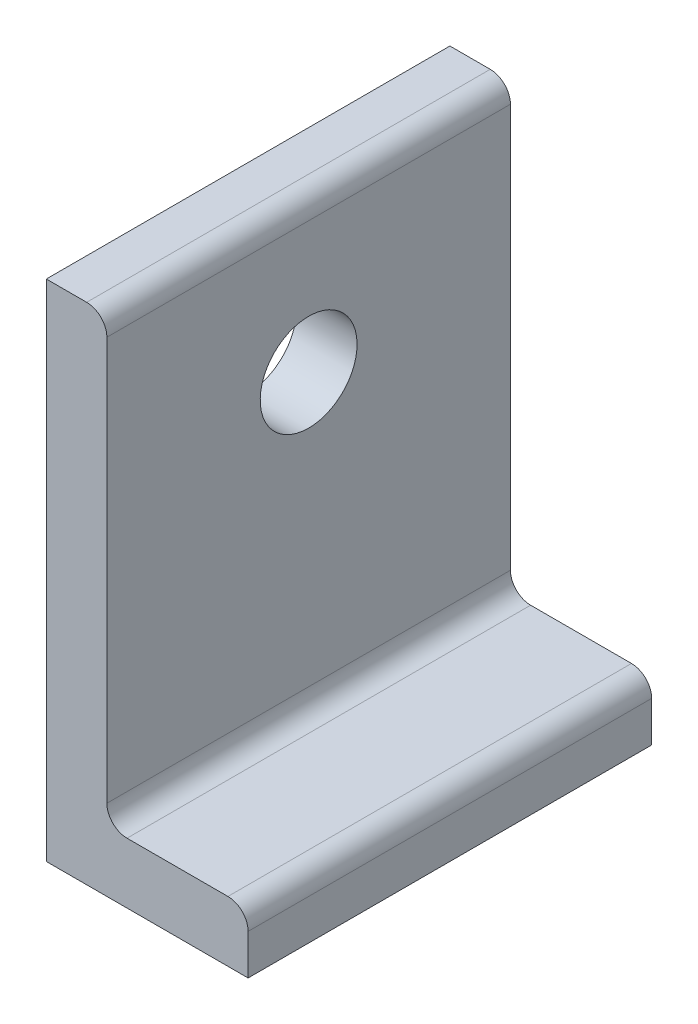
ISO-10303-21;
HEADER;
FILE_DESCRIPTION(('STEP AP214'),'2;1');
FILE_NAME('part.step','',(''),(''),'','','');
FILE_SCHEMA(('AUTOMOTIVE_DESIGN { 1 0 10303 214 1 1 1 1 }'));
ENDSEC;
DATA;
#1=APPLICATION_CONTEXT('core data for automotive mechanical design processes');
#2=APPLICATION_PROTOCOL_DEFINITION('international standard','automotive_design',2000,#1);
#3=PRODUCT_CONTEXT('',#1,'mechanical');
#4=PRODUCT('Part','Part','',(#3));
#5=PRODUCT_RELATED_PRODUCT_CATEGORY('part','',(#4));
#6=PRODUCT_DEFINITION_FORMATION('','',#4);
#7=PRODUCT_DEFINITION_CONTEXT('part definition',#1,'design');
#8=PRODUCT_DEFINITION('design','',#6,#7);
#9=PRODUCT_DEFINITION_SHAPE('','',#8);
#10=(LENGTH_UNIT() NAMED_UNIT(*) SI_UNIT(.MILLI.,.METRE.));
#11=(NAMED_UNIT(*) PLANE_ANGLE_UNIT() SI_UNIT($,.RADIAN.));
#12=(NAMED_UNIT(*) SI_UNIT($,.STERADIAN.) SOLID_ANGLE_UNIT());
#13=UNCERTAINTY_MEASURE_WITH_UNIT(LENGTH_MEASURE(1.E-05),#10,'distance_accuracy_value','');
#14=(GEOMETRIC_REPRESENTATION_CONTEXT(3) GLOBAL_UNCERTAINTY_ASSIGNED_CONTEXT((#13)) GLOBAL_UNIT_ASSIGNED_CONTEXT((#10,
#11,#12)) REPRESENTATION_CONTEXT('',''));
#15=CARTESIAN_POINT('',(0.,0.,0.));
#16=DIRECTION('',(0.,0.,1.));
#17=DIRECTION('',(1.,0.,0.));
#18=AXIS2_PLACEMENT_3D('',#15,#16,#17);
#19=CARTESIAN_POINT('',(3.,25.,20.));
#20=DIRECTION('',(0.,-1.,0.));
#21=DIRECTION('',(0.,0.,-1.));
#22=AXIS2_PLACEMENT_3D('',#19,#20,#21);
#23=PLANE('',#22);
#24=DIRECTION('',(-1.,0.,0.));
#25=VECTOR('',#24,1.);
#26=CARTESIAN_POINT('',(3.,25.,20.));
#27=LINE('',#26,#25);
#28=CARTESIAN_POINT('',(2.,25.,20.));
#29=VERTEX_POINT('',#28);
#30=CARTESIAN_POINT('',(0.,25.,20.));
#31=VERTEX_POINT('',#30);
#32=EDGE_CURVE('E104',#29,#31,#27,.T.);
#33=ORIENTED_EDGE('',*,*,#32,.F.);
#34=DIRECTION('',(0.,0.,-1.));
#35=VECTOR('',#34,1.);
#36=CARTESIAN_POINT('',(2.,25.,20.));
#37=LINE('',#36,#35);
#38=CARTESIAN_POINT('',(2.,25.,0.));
#39=VERTEX_POINT('',#38);
#40=EDGE_CURVE('E153',#29,#39,#37,.T.);
#41=ORIENTED_EDGE('',*,*,#40,.T.);
#42=DIRECTION('',(-1.,0.,0.));
#43=VECTOR('',#42,1.);
#44=CARTESIAN_POINT('',(3.,25.,0.));
#45=LINE('',#44,#43);
#46=CARTESIAN_POINT('',(0.,25.,0.));
#47=VERTEX_POINT('',#46);
#48=EDGE_CURVE('E128',#39,#47,#45,.T.);
#49=ORIENTED_EDGE('',*,*,#48,.T.);
#50=DIRECTION('',(0.,0.,-1.));
#51=VECTOR('',#50,1.);
#52=CARTESIAN_POINT('',(0.,25.,20.));
#53=LINE('',#52,#51);
#54=EDGE_CURVE('E121',#31,#47,#53,.T.);
#55=ORIENTED_EDGE('',*,*,#54,.F.);
#56=EDGE_LOOP('',(#33,#41,#49,#55));
#57=FACE_BOUND('',#56,.T.);
#58=ADVANCED_FACE('F35',(#57),#23,.F.);
#59=CARTESIAN_POINT('',(0.,25.,20.));
#60=DIRECTION('',(1.,0.,0.));
#61=DIRECTION('',(0.,1.,0.));
#62=AXIS2_PLACEMENT_3D('',#59,#60,#61);
#63=PLANE('',#62);
#64=CARTESIAN_POINT('',(0.,17.5,10.));
#65=DIRECTION('',(-1.,0.,0.));
#66=DIRECTION('',(0.,-1.,0.));
#67=AXIS2_PLACEMENT_3D('',#64,#65,#66);
#68=CIRCLE('',#67,2.4);
#69=CARTESIAN_POINT('',(0.,15.1,10.));
#70=VERTEX_POINT('',#69);
#71=EDGE_CURVE('E140',#70,#70,#68,.T.);
#72=ORIENTED_EDGE('',*,*,#71,.F.);
#73=EDGE_LOOP('',(#72));
#74=FACE_BOUND('',#73,.T.);
#75=DIRECTION('',(0.,-1.,0.));
#76=VECTOR('',#75,1.);
#77=CARTESIAN_POINT('',(0.,25.,0.));
#78=LINE('',#77,#76);
#79=CARTESIAN_POINT('',(0.,0.,0.));
#80=VERTEX_POINT('',#79);
#81=EDGE_CURVE('E183',#47,#80,#78,.T.);
#82=ORIENTED_EDGE('',*,*,#81,.T.);
#83=DIRECTION('',(0.,0.,-1.));
#84=VECTOR('',#83,1.);
#85=CARTESIAN_POINT('',(0.,0.,20.));
#86=LINE('',#85,#84);
#87=CARTESIAN_POINT('',(0.,0.,20.));
#88=VERTEX_POINT('',#87);
#89=EDGE_CURVE('E123',#88,#80,#86,.T.);
#90=ORIENTED_EDGE('',*,*,#89,.F.);
#91=DIRECTION('',(0.,-1.,0.));
#92=VECTOR('',#91,1.);
#93=CARTESIAN_POINT('',(0.,25.,20.));
#94=LINE('',#93,#92);
#95=EDGE_CURVE('E108',#31,#88,#94,.T.);
#96=ORIENTED_EDGE('',*,*,#95,.F.);
#97=ORIENTED_EDGE('',*,*,#54,.T.);
#98=EDGE_LOOP('',(#82,#90,#96,#97));
#99=FACE_BOUND('',#98,.T.);
#100=ADVANCED_FACE('F120',(#74,#99),#63,.F.);
#101=CARTESIAN_POINT('',(0.,0.,20.));
#102=DIRECTION('',(0.,1.,0.));
#103=DIRECTION('',(0.,0.,1.));
#104=AXIS2_PLACEMENT_3D('',#101,#102,#103);
#105=PLANE('',#104);
#106=DIRECTION('',(1.,0.,0.));
#107=VECTOR('',#106,1.);
#108=CARTESIAN_POINT('',(0.,0.,0.));
#109=LINE('',#108,#107);
#110=CARTESIAN_POINT('',(10.,0.,0.));
#111=VERTEX_POINT('',#110);
#112=EDGE_CURVE('E185',#80,#111,#109,.T.);
#113=ORIENTED_EDGE('',*,*,#112,.T.);
#114=DIRECTION('',(0.,0.,-1.));
#115=VECTOR('',#114,1.);
#116=CARTESIAN_POINT('',(10.,0.,20.));
#117=LINE('',#116,#115);
#118=CARTESIAN_POINT('',(10.,0.,20.));
#119=VERTEX_POINT('',#118);
#120=EDGE_CURVE('E134',#119,#111,#117,.T.);
#121=ORIENTED_EDGE('',*,*,#120,.F.);
#122=DIRECTION('',(1.,0.,0.));
#123=VECTOR('',#122,1.);
#124=CARTESIAN_POINT('',(0.,0.,20.));
#125=LINE('',#124,#123);
#126=EDGE_CURVE('E125',#88,#119,#125,.T.);
#127=ORIENTED_EDGE('',*,*,#126,.F.);
#128=ORIENTED_EDGE('',*,*,#89,.T.);
#129=EDGE_LOOP('',(#113,#121,#127,#128));
#130=FACE_BOUND('',#129,.T.);
#131=ADVANCED_FACE('F208',(#130),#105,.F.);
#132=CARTESIAN_POINT('',(10.,0.,20.));
#133=DIRECTION('',(-1.,0.,0.));
#134=DIRECTION('',(0.,0.,1.));
#135=AXIS2_PLACEMENT_3D('',#132,#133,#134);
#136=PLANE('',#135);
#137=DIRECTION('',(0.,1.,0.));
#138=VECTOR('',#137,1.);
#139=CARTESIAN_POINT('',(10.,0.,0.));
#140=LINE('',#139,#138);
#141=CARTESIAN_POINT('',(10.,2.,0.));
#142=VERTEX_POINT('',#141);
#143=EDGE_CURVE('E171',#111,#142,#140,.T.);
#144=ORIENTED_EDGE('',*,*,#143,.T.);
#145=DIRECTION('',(0.,0.,-1.));
#146=VECTOR('',#145,1.);
#147=CARTESIAN_POINT('',(10.,2.,20.));
#148=LINE('',#147,#146);
#149=CARTESIAN_POINT('',(10.,2.,20.));
#150=VERTEX_POINT('',#149);
#151=EDGE_CURVE('E148',#142,#150,#148,.F.);
#152=ORIENTED_EDGE('',*,*,#151,.T.);
#153=DIRECTION('',(0.,1.,0.));
#154=VECTOR('',#153,1.);
#155=CARTESIAN_POINT('',(10.,0.,20.));
#156=LINE('',#155,#154);
#157=EDGE_CURVE('E178',#119,#150,#156,.T.);
#158=ORIENTED_EDGE('',*,*,#157,.F.);
#159=ORIENTED_EDGE('',*,*,#120,.T.);
#160=EDGE_LOOP('',(#144,#152,#158,#159));
#161=FACE_BOUND('',#160,.T.);
#162=ADVANCED_FACE('F192',(#161),#136,.F.);
#163=CARTESIAN_POINT('',(10.,3.,20.));
#164=DIRECTION('',(0.,-1.,0.));
#165=DIRECTION('',(1.,0.,0.));
#166=AXIS2_PLACEMENT_3D('',#163,#164,#165);
#167=PLANE('',#166);
#168=DIRECTION('',(-1.,0.,0.));
#169=VECTOR('',#168,1.);
#170=CARTESIAN_POINT('',(10.,3.,20.));
#171=LINE('',#170,#169);
#172=CARTESIAN_POINT('',(9.,3.,20.));
#173=VERTEX_POINT('',#172);
#174=CARTESIAN_POINT('',(4.,3.,20.));
#175=VERTEX_POINT('',#174);
#176=EDGE_CURVE('E175',#173,#175,#171,.T.);
#177=ORIENTED_EDGE('',*,*,#176,.F.);
#178=DIRECTION('',(0.,0.,-1.));
#179=VECTOR('',#178,1.);
#180=CARTESIAN_POINT('',(9.,3.,20.));
#181=LINE('',#180,#179);
#182=CARTESIAN_POINT('',(9.,3.,0.));
#183=VERTEX_POINT('',#182);
#184=EDGE_CURVE('E132',#173,#183,#181,.T.);
#185=ORIENTED_EDGE('',*,*,#184,.T.);
#186=DIRECTION('',(-1.,0.,0.));
#187=VECTOR('',#186,1.);
#188=CARTESIAN_POINT('',(10.,3.,0.));
#189=LINE('',#188,#187);
#190=CARTESIAN_POINT('',(4.,3.,0.));
#191=VERTEX_POINT('',#190);
#192=EDGE_CURVE('E163',#183,#191,#189,.T.);
#193=ORIENTED_EDGE('',*,*,#192,.T.);
#194=DIRECTION('',(0.,0.,-1.));
#195=VECTOR('',#194,1.);
#196=CARTESIAN_POINT('',(4.,3.,20.));
#197=LINE('',#196,#195);
#198=EDGE_CURVE('E130',#191,#175,#197,.F.);
#199=ORIENTED_EDGE('',*,*,#198,.T.);
#200=EDGE_LOOP('',(#177,#185,#193,#199));
#201=FACE_BOUND('',#200,.T.);
#202=ADVANCED_FACE('F169',(#201),#167,.F.);
#203=CARTESIAN_POINT('',(3.,3.,20.));
#204=DIRECTION('',(-1.,0.,0.));
#205=DIRECTION('',(0.,-1.,0.));
#206=AXIS2_PLACEMENT_3D('',#203,#204,#205);
#207=PLANE('',#206);
#208=CARTESIAN_POINT('',(3.,17.5,10.));
#209=DIRECTION('',(-1.,0.,0.));
#210=DIRECTION('',(0.,-1.,0.));
#211=AXIS2_PLACEMENT_3D('',#208,#209,#210);
#212=CIRCLE('',#211,2.4);
#213=CARTESIAN_POINT('',(3.,15.1,10.));
#214=VERTEX_POINT('',#213);
#215=EDGE_CURVE('E138',#214,#214,#212,.T.);
#216=ORIENTED_EDGE('',*,*,#215,.T.);
#217=EDGE_LOOP('',(#216));
#218=FACE_BOUND('',#217,.T.);
#219=DIRECTION('',(0.,1.,0.));
#220=VECTOR('',#219,1.);
#221=CARTESIAN_POINT('',(3.,3.,0.));
#222=LINE('',#221,#220);
#223=CARTESIAN_POINT('',(3.,4.,0.));
#224=VERTEX_POINT('',#223);
#225=CARTESIAN_POINT('',(3.,24.,0.));
#226=VERTEX_POINT('',#225);
#227=EDGE_CURVE('E116',#224,#226,#222,.T.);
#228=ORIENTED_EDGE('',*,*,#227,.T.);
#229=DIRECTION('',(0.,0.,-1.));
#230=VECTOR('',#229,1.);
#231=CARTESIAN_POINT('',(3.,24.,20.));
#232=LINE('',#231,#230);
#233=CARTESIAN_POINT('',(3.,24.,20.));
#234=VERTEX_POINT('',#233);
#235=EDGE_CURVE('E50',#226,#234,#232,.F.);
#236=ORIENTED_EDGE('',*,*,#235,.T.);
#237=DIRECTION('',(0.,1.,0.));
#238=VECTOR('',#237,1.);
#239=CARTESIAN_POINT('',(3.,3.,20.));
#240=LINE('',#239,#238);
#241=CARTESIAN_POINT('',(3.,4.,20.));
#242=VERTEX_POINT('',#241);
#243=EDGE_CURVE('E174',#242,#234,#240,.T.);
#244=ORIENTED_EDGE('',*,*,#243,.F.);
#245=DIRECTION('',(0.,0.,-1.));
#246=VECTOR('',#245,1.);
#247=CARTESIAN_POINT('',(3.,4.,0.));
#248=LINE('',#247,#246);
#249=EDGE_CURVE('E155',#242,#224,#248,.T.);
#250=ORIENTED_EDGE('',*,*,#249,.T.);
#251=EDGE_LOOP('',(#228,#236,#244,#250));
#252=FACE_BOUND('',#251,.T.);
#253=ADVANCED_FACE('F173',(#218,#252),#207,.F.);
#254=CARTESIAN_POINT('',(0.,0.,20.));
#255=DIRECTION('',(0.,0.,1.));
#256=DIRECTION('',(1.,0.,0.));
#257=AXIS2_PLACEMENT_3D('',#254,#255,#256);
#258=PLANE('',#257);
#259=ORIENTED_EDGE('',*,*,#157,.T.);
#260=CARTESIAN_POINT('',(9.,2.,20.));
#261=DIRECTION('',(0.,0.,1.));
#262=DIRECTION('',(1.,0.,0.));
#263=AXIS2_PLACEMENT_3D('',#260,#261,#262);
#264=CIRCLE('',#263,1.);
#265=EDGE_CURVE('E151',#150,#173,#264,.T.);
#266=ORIENTED_EDGE('',*,*,#265,.T.);
#267=ORIENTED_EDGE('',*,*,#176,.T.);
#268=CARTESIAN_POINT('',(4.,4.,20.));
#269=DIRECTION('',(0.,0.,1.));
#270=DIRECTION('',(1.,0.,0.));
#271=AXIS2_PLACEMENT_3D('',#268,#269,#270);
#272=CIRCLE('',#271,1.);
#273=EDGE_CURVE('E11',#175,#242,#272,.F.);
#274=ORIENTED_EDGE('',*,*,#273,.T.);
#275=ORIENTED_EDGE('',*,*,#243,.T.);
#276=CARTESIAN_POINT('',(2.,24.,20.));
#277=DIRECTION('',(0.,0.,1.));
#278=DIRECTION('',(1.,0.,0.));
#279=AXIS2_PLACEMENT_3D('',#276,#277,#278);
#280=CIRCLE('',#279,1.);
#281=EDGE_CURVE('E111',#234,#29,#280,.T.);
#282=ORIENTED_EDGE('',*,*,#281,.T.);
#283=ORIENTED_EDGE('',*,*,#32,.T.);
#284=ORIENTED_EDGE('',*,*,#95,.T.);
#285=ORIENTED_EDGE('',*,*,#126,.T.);
#286=EDGE_LOOP('',(#259,#266,#267,#274,#275,#282,#283,#284,#285));
#287=FACE_BOUND('',#286,.T.);
#288=ADVANCED_FACE('F107',(#287),#258,.T.);
#289=CARTESIAN_POINT('',(0.,0.,0.));
#290=DIRECTION('',(0.,0.,1.));
#291=DIRECTION('',(1.,0.,0.));
#292=AXIS2_PLACEMENT_3D('',#289,#290,#291);
#293=PLANE('',#292);
#294=ORIENTED_EDGE('',*,*,#192,.F.);
#295=CARTESIAN_POINT('',(9.,2.,0.));
#296=DIRECTION('',(0.,0.,1.));
#297=DIRECTION('',(1.,0.,0.));
#298=AXIS2_PLACEMENT_3D('',#295,#296,#297);
#299=CIRCLE('',#298,1.);
#300=EDGE_CURVE('E146',#183,#142,#299,.F.);
#301=ORIENTED_EDGE('',*,*,#300,.T.);
#302=ORIENTED_EDGE('',*,*,#143,.F.);
#303=ORIENTED_EDGE('',*,*,#112,.F.);
#304=ORIENTED_EDGE('',*,*,#81,.F.);
#305=ORIENTED_EDGE('',*,*,#48,.F.);
#306=CARTESIAN_POINT('',(2.,24.,0.));
#307=DIRECTION('',(0.,0.,1.));
#308=DIRECTION('',(1.,0.,0.));
#309=AXIS2_PLACEMENT_3D('',#306,#307,#308);
#310=CIRCLE('',#309,1.);
#311=EDGE_CURVE('E144',#39,#226,#310,.F.);
#312=ORIENTED_EDGE('',*,*,#311,.T.);
#313=ORIENTED_EDGE('',*,*,#227,.F.);
#314=CARTESIAN_POINT('',(4.,4.,0.));
#315=DIRECTION('',(0.,0.,1.));
#316=DIRECTION('',(1.,0.,0.));
#317=AXIS2_PLACEMENT_3D('',#314,#315,#316);
#318=CIRCLE('',#317,1.);
#319=EDGE_CURVE('E43',#224,#191,#318,.T.);
#320=ORIENTED_EDGE('',*,*,#319,.T.);
#321=EDGE_LOOP('',(#294,#301,#302,#303,#304,#305,#312,#313,#320));
#322=FACE_BOUND('',#321,.T.);
#323=ADVANCED_FACE('F162',(#322),#293,.F.);
#324=CARTESIAN_POINT('',(15.,17.5,10.));
#325=DIRECTION('',(-1.,0.,0.));
#326=DIRECTION('',(0.,-1.,0.));
#327=AXIS2_PLACEMENT_3D('',#324,#325,#326);
#328=CYLINDRICAL_SURFACE('',#327,2.4);
#329=ORIENTED_EDGE('',*,*,#71,.T.);
#330=EDGE_LOOP('',(#329));
#331=FACE_BOUND('',#330,.T.);
#332=ORIENTED_EDGE('',*,*,#215,.F.);
#333=EDGE_LOOP('',(#332));
#334=FACE_BOUND('',#333,.T.);
#335=ADVANCED_FACE('F204',(#331,#334),#328,.F.);
#336=CARTESIAN_POINT('',(9.,2.,20.));
#337=DIRECTION('',(0.,0.,-1.));
#338=DIRECTION('',(-1.,0.,0.));
#339=AXIS2_PLACEMENT_3D('',#336,#337,#338);
#340=CYLINDRICAL_SURFACE('',#339,1.);
#341=ORIENTED_EDGE('',*,*,#265,.F.);
#342=ORIENTED_EDGE('',*,*,#151,.F.);
#343=ORIENTED_EDGE('',*,*,#300,.F.);
#344=ORIENTED_EDGE('',*,*,#184,.F.);
#345=EDGE_LOOP('',(#341,#342,#343,#344));
#346=FACE_BOUND('',#345,.T.);
#347=ADVANCED_FACE('F198',(#346),#340,.T.);
#348=CARTESIAN_POINT('',(2.,24.,20.));
#349=DIRECTION('',(0.,0.,-1.));
#350=DIRECTION('',(-1.,0.,0.));
#351=AXIS2_PLACEMENT_3D('',#348,#349,#350);
#352=CYLINDRICAL_SURFACE('',#351,1.);
#353=ORIENTED_EDGE('',*,*,#281,.F.);
#354=ORIENTED_EDGE('',*,*,#235,.F.);
#355=ORIENTED_EDGE('',*,*,#311,.F.);
#356=ORIENTED_EDGE('',*,*,#40,.F.);
#357=EDGE_LOOP('',(#353,#354,#355,#356));
#358=FACE_BOUND('',#357,.T.);
#359=ADVANCED_FACE('F220',(#358),#352,.T.);
#360=CARTESIAN_POINT('',(4.,4.,20.));
#361=DIRECTION('',(0.,0.,1.));
#362=DIRECTION('',(1.,0.,0.));
#363=AXIS2_PLACEMENT_3D('',#360,#361,#362);
#364=CYLINDRICAL_SURFACE('',#363,1.);
#365=ORIENTED_EDGE('',*,*,#273,.F.);
#366=ORIENTED_EDGE('',*,*,#198,.F.);
#367=ORIENTED_EDGE('',*,*,#319,.F.);
#368=ORIENTED_EDGE('',*,*,#249,.F.);
#369=EDGE_LOOP('',(#365,#366,#367,#368));
#370=FACE_BOUND('',#369,.T.);
#371=ADVANCED_FACE('F37',(#370),#364,.F.);
#372=CLOSED_SHELL('',(#58,#100,#131,#162,#202,#253,#288,#323,#335,#347,#359,#371));
#373=MANIFOLD_SOLID_BREP('B2',#372);
#374=ADVANCED_BREP_SHAPE_REPRESENTATION('',(#18,#373),#14);
#375=SHAPE_DEFINITION_REPRESENTATION(#9,#374);
ENDSEC;
END-ISO-10303-21;
